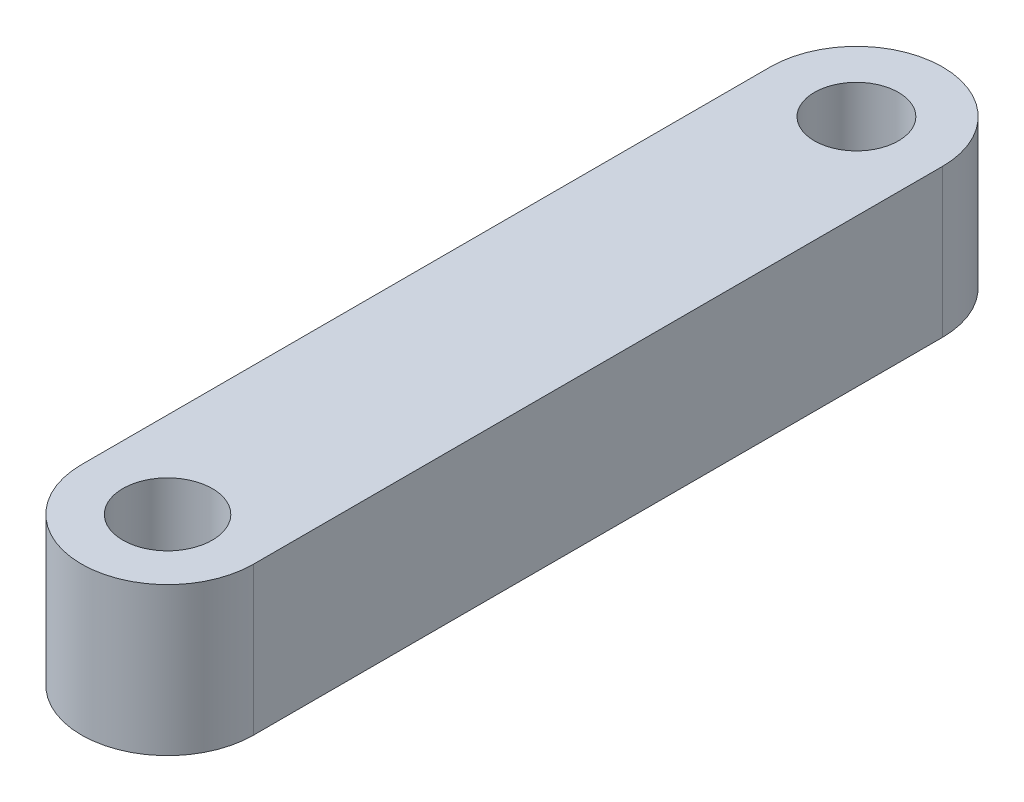
ISO-10303-21;
HEADER;
FILE_DESCRIPTION(('STEP AP214'),'2;1');
FILE_NAME('part.step','',(''),(''),'','','');
FILE_SCHEMA(('AUTOMOTIVE_DESIGN { 1 0 10303 214 1 1 1 1 }'));
ENDSEC;
DATA;
#1=APPLICATION_CONTEXT('core data for automotive mechanical design processes');
#2=APPLICATION_PROTOCOL_DEFINITION('international standard','automotive_design',2000,#1);
#3=PRODUCT_CONTEXT('',#1,'mechanical');
#4=PRODUCT('Part','Part','',(#3));
#5=PRODUCT_RELATED_PRODUCT_CATEGORY('part','',(#4));
#6=PRODUCT_DEFINITION_FORMATION('','',#4);
#7=PRODUCT_DEFINITION_CONTEXT('part definition',#1,'design');
#8=PRODUCT_DEFINITION('design','',#6,#7);
#9=PRODUCT_DEFINITION_SHAPE('','',#8);
#10=(LENGTH_UNIT() NAMED_UNIT(*) SI_UNIT(.MILLI.,.METRE.));
#11=(NAMED_UNIT(*) PLANE_ANGLE_UNIT() SI_UNIT($,.RADIAN.));
#12=(NAMED_UNIT(*) SI_UNIT($,.STERADIAN.) SOLID_ANGLE_UNIT());
#13=UNCERTAINTY_MEASURE_WITH_UNIT(LENGTH_MEASURE(1.E-05),#10,'distance_accuracy_value','');
#14=(GEOMETRIC_REPRESENTATION_CONTEXT(3) GLOBAL_UNCERTAINTY_ASSIGNED_CONTEXT((#13)) GLOBAL_UNIT_ASSIGNED_CONTEXT((#10,
#11,#12)) REPRESENTATION_CONTEXT('',''));
#15=CARTESIAN_POINT('',(0.,0.,0.));
#16=DIRECTION('',(0.,0.,1.));
#17=DIRECTION('',(1.,0.,0.));
#18=AXIS2_PLACEMENT_3D('',#15,#16,#17);
#19=CARTESIAN_POINT('',(0.,5.461,-12.7));
#20=DIRECTION('',(0.,-1.,0.));
#21=DIRECTION('',(0.,0.,-1.));
#22=AXIS2_PLACEMENT_3D('',#19,#20,#21);
#23=CYLINDRICAL_SURFACE('',#22,3.175);
#24=CARTESIAN_POINT('',(0.,0.,-12.7));
#25=DIRECTION('',(0.,1.,0.));
#26=DIRECTION('',(0.,0.,1.));
#27=AXIS2_PLACEMENT_3D('',#24,#25,#26);
#28=CIRCLE('',#27,3.175);
#29=CARTESIAN_POINT('',(3.175,0.,-12.7));
#30=VERTEX_POINT('',#29);
#31=CARTESIAN_POINT('',(-3.175,0.,-12.7));
#32=VERTEX_POINT('',#31);
#33=EDGE_CURVE('E113',#30,#32,#28,.T.);
#34=ORIENTED_EDGE('',*,*,#33,.T.);
#35=DIRECTION('',(0.,-1.,0.));
#36=VECTOR('',#35,1.);
#37=CARTESIAN_POINT('',(-3.175,5.461,-12.7));
#38=LINE('',#37,#36);
#39=CARTESIAN_POINT('',(-3.175,5.461,-12.7));
#40=VERTEX_POINT('',#39);
#41=EDGE_CURVE('E11',#40,#32,#38,.T.);
#42=ORIENTED_EDGE('',*,*,#41,.F.);
#43=CARTESIAN_POINT('',(0.,5.461,-12.7));
#44=DIRECTION('',(0.,1.,0.));
#45=DIRECTION('',(0.,0.,1.));
#46=AXIS2_PLACEMENT_3D('',#43,#44,#45);
#47=CIRCLE('',#46,3.175);
#48=CARTESIAN_POINT('',(3.175,5.461,-12.7));
#49=VERTEX_POINT('',#48);
#50=EDGE_CURVE('E97',#49,#40,#47,.T.);
#51=ORIENTED_EDGE('',*,*,#50,.F.);
#52=DIRECTION('',(0.,-1.,0.));
#53=VECTOR('',#52,1.);
#54=CARTESIAN_POINT('',(3.175,5.461,-12.7));
#55=LINE('',#54,#53);
#56=EDGE_CURVE('E109',#49,#30,#55,.T.);
#57=ORIENTED_EDGE('',*,*,#56,.T.);
#58=EDGE_LOOP('',(#34,#42,#51,#57));
#59=FACE_BOUND('',#58,.T.);
#60=ADVANCED_FACE('F45',(#59),#23,.T.);
#61=CARTESIAN_POINT('',(-3.175,5.461,12.7));
#62=DIRECTION('',(1.,0.,0.));
#63=DIRECTION('',(0.,0.,-1.));
#64=AXIS2_PLACEMENT_3D('',#61,#62,#63);
#65=PLANE('',#64);
#66=DIRECTION('',(0.,0.,1.));
#67=VECTOR('',#66,1.);
#68=CARTESIAN_POINT('',(-3.175,0.,12.7));
#69=LINE('',#68,#67);
#70=CARTESIAN_POINT('',(-3.175,0.,12.7));
#71=VERTEX_POINT('',#70);
#72=EDGE_CURVE('E102',#32,#71,#69,.T.);
#73=ORIENTED_EDGE('',*,*,#72,.T.);
#74=DIRECTION('',(0.,-1.,0.));
#75=VECTOR('',#74,1.);
#76=CARTESIAN_POINT('',(-3.175,5.461,12.7));
#77=LINE('',#76,#75);
#78=CARTESIAN_POINT('',(-3.175,5.461,12.7));
#79=VERTEX_POINT('',#78);
#80=EDGE_CURVE('E54',#79,#71,#77,.T.);
#81=ORIENTED_EDGE('',*,*,#80,.F.);
#82=DIRECTION('',(0.,0.,1.));
#83=VECTOR('',#82,1.);
#84=CARTESIAN_POINT('',(-3.175,5.461,12.7));
#85=LINE('',#84,#83);
#86=EDGE_CURVE('E92',#40,#79,#85,.T.);
#87=ORIENTED_EDGE('',*,*,#86,.F.);
#88=ORIENTED_EDGE('',*,*,#41,.T.);
#89=EDGE_LOOP('',(#73,#81,#87,#88));
#90=FACE_BOUND('',#89,.T.);
#91=ADVANCED_FACE('F101',(#90),#65,.F.);
#92=CARTESIAN_POINT('',(0.,5.461,12.7));
#93=DIRECTION('',(0.,-1.,0.));
#94=DIRECTION('',(0.,0.,-1.));
#95=AXIS2_PLACEMENT_3D('',#92,#93,#94);
#96=CYLINDRICAL_SURFACE('',#95,3.175);
#97=CARTESIAN_POINT('',(0.,0.,12.7));
#98=DIRECTION('',(0.,1.,0.));
#99=DIRECTION('',(0.,0.,1.));
#100=AXIS2_PLACEMENT_3D('',#97,#98,#99);
#101=CIRCLE('',#100,3.175);
#102=CARTESIAN_POINT('',(3.175,0.,12.7));
#103=VERTEX_POINT('',#102);
#104=EDGE_CURVE('E79',#71,#103,#101,.T.);
#105=ORIENTED_EDGE('',*,*,#104,.T.);
#106=DIRECTION('',(0.,-1.,0.));
#107=VECTOR('',#106,1.);
#108=CARTESIAN_POINT('',(3.175,5.461,12.7));
#109=LINE('',#108,#107);
#110=CARTESIAN_POINT('',(3.175,5.461,12.7));
#111=VERTEX_POINT('',#110);
#112=EDGE_CURVE('E104',#111,#103,#109,.T.);
#113=ORIENTED_EDGE('',*,*,#112,.F.);
#114=CARTESIAN_POINT('',(0.,5.461,12.7));
#115=DIRECTION('',(0.,1.,0.));
#116=DIRECTION('',(0.,0.,1.));
#117=AXIS2_PLACEMENT_3D('',#114,#115,#116);
#118=CIRCLE('',#117,3.175);
#119=EDGE_CURVE('E95',#79,#111,#118,.T.);
#120=ORIENTED_EDGE('',*,*,#119,.F.);
#121=ORIENTED_EDGE('',*,*,#80,.T.);
#122=EDGE_LOOP('',(#105,#113,#120,#121));
#123=FACE_BOUND('',#122,.T.);
#124=ADVANCED_FACE('F105',(#123),#96,.T.);
#125=CARTESIAN_POINT('',(3.175,5.461,12.7));
#126=DIRECTION('',(-1.,0.,0.));
#127=DIRECTION('',(0.,0.,1.));
#128=AXIS2_PLACEMENT_3D('',#125,#126,#127);
#129=PLANE('',#128);
#130=DIRECTION('',(0.,0.,-1.));
#131=VECTOR('',#130,1.);
#132=CARTESIAN_POINT('',(3.175,0.,12.7));
#133=LINE('',#132,#131);
#134=EDGE_CURVE('E85',#103,#30,#133,.T.);
#135=ORIENTED_EDGE('',*,*,#134,.T.);
#136=ORIENTED_EDGE('',*,*,#56,.F.);
#137=DIRECTION('',(0.,0.,-1.));
#138=VECTOR('',#137,1.);
#139=CARTESIAN_POINT('',(3.175,5.461,12.7));
#140=LINE('',#139,#138);
#141=EDGE_CURVE('E62',#111,#49,#140,.T.);
#142=ORIENTED_EDGE('',*,*,#141,.F.);
#143=ORIENTED_EDGE('',*,*,#112,.T.);
#144=EDGE_LOOP('',(#135,#136,#142,#143));
#145=FACE_BOUND('',#144,.T.);
#146=ADVANCED_FACE('F127',(#145),#129,.F.);
#147=CARTESIAN_POINT('',(0.,5.461,-12.7));
#148=DIRECTION('',(0.,1.,0.));
#149=DIRECTION('',(0.,0.,1.));
#150=AXIS2_PLACEMENT_3D('',#147,#148,#149);
#151=PLANE('',#150);
#152=CARTESIAN_POINT('',(0.,5.461,-12.7));
#153=DIRECTION('',(0.,1.,0.));
#154=DIRECTION('',(0.,0.,1.));
#155=AXIS2_PLACEMENT_3D('',#152,#153,#154);
#156=CIRCLE('',#155,1.55);
#157=CARTESIAN_POINT('',(0.,5.461,-11.15));
#158=VERTEX_POINT('',#157);
#159=EDGE_CURVE('E145',#158,#158,#156,.T.);
#160=ORIENTED_EDGE('',*,*,#159,.F.);
#161=EDGE_LOOP('',(#160));
#162=FACE_BOUND('',#161,.T.);
#163=CARTESIAN_POINT('',(0.,5.461,12.7));
#164=DIRECTION('',(0.,1.,0.));
#165=DIRECTION('',(0.,0.,1.));
#166=AXIS2_PLACEMENT_3D('',#163,#164,#165);
#167=CIRCLE('',#166,1.65);
#168=CARTESIAN_POINT('',(0.,5.461,14.35));
#169=VERTEX_POINT('',#168);
#170=EDGE_CURVE('E137',#169,#169,#167,.T.);
#171=ORIENTED_EDGE('',*,*,#170,.F.);
#172=EDGE_LOOP('',(#171));
#173=FACE_BOUND('',#172,.T.);
#174=ORIENTED_EDGE('',*,*,#50,.T.);
#175=ORIENTED_EDGE('',*,*,#86,.T.);
#176=ORIENTED_EDGE('',*,*,#119,.T.);
#177=ORIENTED_EDGE('',*,*,#141,.T.);
#178=EDGE_LOOP('',(#174,#175,#176,#177));
#179=FACE_BOUND('',#178,.T.);
#180=ADVANCED_FACE('F93',(#162,#173,#179),#151,.T.);
#181=CARTESIAN_POINT('',(0.,0.,-12.7));
#182=DIRECTION('',(0.,1.,0.));
#183=DIRECTION('',(0.,0.,1.));
#184=AXIS2_PLACEMENT_3D('',#181,#182,#183);
#185=PLANE('',#184);
#186=CARTESIAN_POINT('',(0.,0.,-12.7));
#187=DIRECTION('',(0.,1.,0.));
#188=DIRECTION('',(0.,0.,1.));
#189=AXIS2_PLACEMENT_3D('',#186,#187,#188);
#190=CIRCLE('',#189,1.55);
#191=CARTESIAN_POINT('',(0.,0.,-11.15));
#192=VERTEX_POINT('',#191);
#193=EDGE_CURVE('E141',#192,#192,#190,.T.);
#194=ORIENTED_EDGE('',*,*,#193,.T.);
#195=EDGE_LOOP('',(#194));
#196=FACE_BOUND('',#195,.T.);
#197=CARTESIAN_POINT('',(0.,0.,12.7));
#198=DIRECTION('',(0.,1.,0.));
#199=DIRECTION('',(0.,0.,1.));
#200=AXIS2_PLACEMENT_3D('',#197,#198,#199);
#201=CIRCLE('',#200,1.65);
#202=CARTESIAN_POINT('',(0.,0.,14.35));
#203=VERTEX_POINT('',#202);
#204=EDGE_CURVE('E117',#203,#203,#201,.T.);
#205=ORIENTED_EDGE('',*,*,#204,.T.);
#206=EDGE_LOOP('',(#205));
#207=FACE_BOUND('',#206,.T.);
#208=ORIENTED_EDGE('',*,*,#33,.F.);
#209=ORIENTED_EDGE('',*,*,#134,.F.);
#210=ORIENTED_EDGE('',*,*,#104,.F.);
#211=ORIENTED_EDGE('',*,*,#72,.F.);
#212=EDGE_LOOP('',(#208,#209,#210,#211));
#213=FACE_BOUND('',#212,.T.);
#214=ADVANCED_FACE('F130',(#196,#207,#213),#185,.F.);
#215=CARTESIAN_POINT('',(0.,5.461,12.7));
#216=DIRECTION('',(0.,1.,0.));
#217=DIRECTION('',(0.,0.,1.));
#218=AXIS2_PLACEMENT_3D('',#215,#216,#217);
#219=CYLINDRICAL_SURFACE('',#218,1.65);
#220=ORIENTED_EDGE('',*,*,#204,.F.);
#221=EDGE_LOOP('',(#220));
#222=FACE_BOUND('',#221,.T.);
#223=ORIENTED_EDGE('',*,*,#170,.T.);
#224=EDGE_LOOP('',(#223));
#225=FACE_BOUND('',#224,.T.);
#226=ADVANCED_FACE('F157',(#222,#225),#219,.F.);
#227=CARTESIAN_POINT('',(0.,5.461,-12.7));
#228=DIRECTION('',(0.,1.,0.));
#229=DIRECTION('',(0.,0.,1.));
#230=AXIS2_PLACEMENT_3D('',#227,#228,#229);
#231=CYLINDRICAL_SURFACE('',#230,1.55);
#232=ORIENTED_EDGE('',*,*,#193,.F.);
#233=EDGE_LOOP('',(#232));
#234=FACE_BOUND('',#233,.T.);
#235=ORIENTED_EDGE('',*,*,#159,.T.);
#236=EDGE_LOOP('',(#235));
#237=FACE_BOUND('',#236,.T.);
#238=ADVANCED_FACE('F150',(#234,#237),#231,.F.);
#239=CLOSED_SHELL('',(#60,#91,#124,#146,#180,#214,#226,#238));
#240=MANIFOLD_SOLID_BREP('B2',#239);
#241=ADVANCED_BREP_SHAPE_REPRESENTATION('',(#18,#240),#14);
#242=SHAPE_DEFINITION_REPRESENTATION(#9,#241);
ENDSEC;
END-ISO-10303-21;
